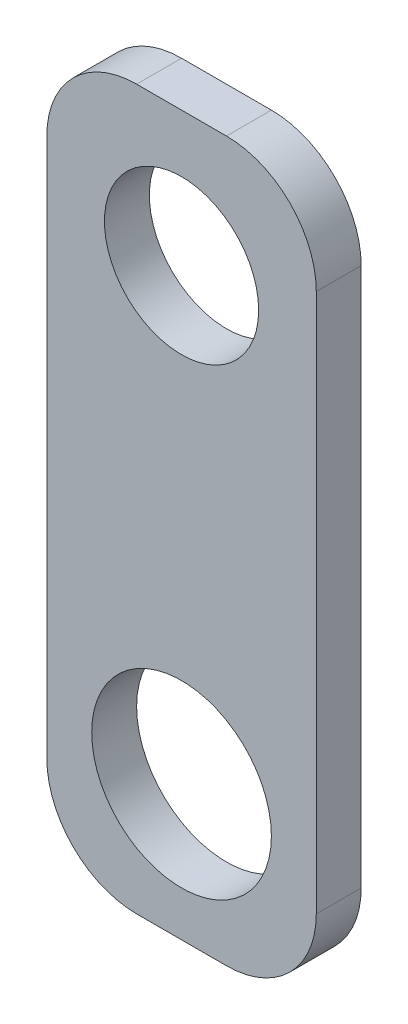
ISO-10303-21;
HEADER;
FILE_DESCRIPTION(('STEP AP214'),'2;1');
FILE_NAME('part.step','',(''),(''),'','','');
FILE_SCHEMA(('AUTOMOTIVE_DESIGN { 1 0 10303 214 1 1 1 1 }'));
ENDSEC;
DATA;
#1=APPLICATION_CONTEXT('core data for automotive mechanical design processes');
#2=APPLICATION_PROTOCOL_DEFINITION('international standard','automotive_design',2000,#1);
#3=PRODUCT_CONTEXT('',#1,'mechanical');
#4=PRODUCT('Part','Part','',(#3));
#5=PRODUCT_RELATED_PRODUCT_CATEGORY('part','',(#4));
#6=PRODUCT_DEFINITION_FORMATION('','',#4);
#7=PRODUCT_DEFINITION_CONTEXT('part definition',#1,'design');
#8=PRODUCT_DEFINITION('design','',#6,#7);
#9=PRODUCT_DEFINITION_SHAPE('','',#8);
#10=(LENGTH_UNIT() NAMED_UNIT(*) SI_UNIT(.MILLI.,.METRE.));
#11=(NAMED_UNIT(*) PLANE_ANGLE_UNIT() SI_UNIT($,.RADIAN.));
#12=(NAMED_UNIT(*) SI_UNIT($,.STERADIAN.) SOLID_ANGLE_UNIT());
#13=UNCERTAINTY_MEASURE_WITH_UNIT(LENGTH_MEASURE(1.E-05),#10,'distance_accuracy_value','');
#14=(GEOMETRIC_REPRESENTATION_CONTEXT(3) GLOBAL_UNCERTAINTY_ASSIGNED_CONTEXT((#13)) GLOBAL_UNIT_ASSIGNED_CONTEXT((#10,
#11,#12)) REPRESENTATION_CONTEXT('',''));
#15=CARTESIAN_POINT('',(0.,0.,0.));
#16=DIRECTION('',(0.,0.,1.));
#17=DIRECTION('',(1.,0.,0.));
#18=AXIS2_PLACEMENT_3D('',#15,#16,#17);
#19=CARTESIAN_POINT('',(12.7,12.7,6.35));
#20=DIRECTION('',(0.,0.,-1.));
#21=DIRECTION('',(-1.,0.,0.));
#22=AXIS2_PLACEMENT_3D('',#19,#20,#21);
#23=PLANE('',#22);
#24=CARTESIAN_POINT('',(12.7,12.7,6.35));
#25=DIRECTION('',(0.,0.,1.));
#26=DIRECTION('',(-1.,0.,0.));
#27=AXIS2_PLACEMENT_3D('',#24,#25,#26);
#28=CIRCLE('',#27,12.7);
#29=CARTESIAN_POINT('',(0.,12.7000000000001,6.35));
#30=VERTEX_POINT('',#29);
#31=CARTESIAN_POINT('',(12.7000000000001,0.,6.35));
#32=VERTEX_POINT('',#31);
#33=EDGE_CURVE('E168',#30,#32,#28,.T.);
#34=ORIENTED_EDGE('',*,*,#33,.T.);
#35=DIRECTION('',(1.,0.,0.));
#36=VECTOR('',#35,1.);
#37=CARTESIAN_POINT('',(12.7000000000001,0.,6.35));
#38=LINE('',#37,#36);
#39=CARTESIAN_POINT('',(25.3999999999999,0.,6.35));
#40=VERTEX_POINT('',#39);
#41=EDGE_CURVE('E106',#32,#40,#38,.T.);
#42=ORIENTED_EDGE('',*,*,#41,.T.);
#43=CARTESIAN_POINT('',(25.4,12.7,6.35));
#44=DIRECTION('',(0.,0.,1.));
#45=DIRECTION('',(1.,0.,0.));
#46=AXIS2_PLACEMENT_3D('',#43,#44,#45);
#47=CIRCLE('',#46,12.7);
#48=CARTESIAN_POINT('',(38.1,12.7,6.35));
#49=VERTEX_POINT('',#48);
#50=EDGE_CURVE('E191',#40,#49,#47,.T.);
#51=ORIENTED_EDGE('',*,*,#50,.T.);
#52=DIRECTION('',(0.,1.,0.));
#53=VECTOR('',#52,1.);
#54=CARTESIAN_POINT('',(38.1,12.7000000000001,6.35));
#55=LINE('',#54,#53);
#56=CARTESIAN_POINT('',(38.1,88.8999999999999,6.35));
#57=VERTEX_POINT('',#56);
#58=EDGE_CURVE('E202',#49,#57,#55,.T.);
#59=ORIENTED_EDGE('',*,*,#58,.T.);
#60=CARTESIAN_POINT('',(25.4,88.9,6.35));
#61=DIRECTION('',(0.,0.,1.));
#62=DIRECTION('',(-1.,0.,0.));
#63=AXIS2_PLACEMENT_3D('',#60,#61,#62);
#64=CIRCLE('',#63,12.7);
#65=CARTESIAN_POINT('',(25.3999999999999,101.6,6.35));
#66=VERTEX_POINT('',#65);
#67=EDGE_CURVE('E124',#57,#66,#64,.T.);
#68=ORIENTED_EDGE('',*,*,#67,.T.);
#69=DIRECTION('',(-1.,0.,0.));
#70=VECTOR('',#69,1.);
#71=CARTESIAN_POINT('',(12.7000000000001,101.6,6.35));
#72=LINE('',#71,#70);
#73=CARTESIAN_POINT('',(12.7000000000001,101.6,6.35));
#74=VERTEX_POINT('',#73);
#75=EDGE_CURVE('E116',#66,#74,#72,.T.);
#76=ORIENTED_EDGE('',*,*,#75,.T.);
#77=CARTESIAN_POINT('',(12.7,88.9,6.35));
#78=DIRECTION('',(0.,0.,1.));
#79=DIRECTION('',(-1.,0.,0.));
#80=AXIS2_PLACEMENT_3D('',#77,#78,#79);
#81=CIRCLE('',#80,12.7);
#82=CARTESIAN_POINT('',(0.,88.8999999999999,6.35));
#83=VERTEX_POINT('',#82);
#84=EDGE_CURVE('E123',#74,#83,#81,.T.);
#85=ORIENTED_EDGE('',*,*,#84,.T.);
#86=DIRECTION('',(0.,-1.,0.));
#87=VECTOR('',#86,1.);
#88=CARTESIAN_POINT('',(0.,12.7000000000001,6.35));
#89=LINE('',#88,#87);
#90=EDGE_CURVE('E64',#83,#30,#89,.T.);
#91=ORIENTED_EDGE('',*,*,#90,.T.);
#92=EDGE_LOOP('',(#34,#42,#51,#59,#68,#76,#85,#91));
#93=FACE_BOUND('',#92,.T.);
#94=CARTESIAN_POINT('',(19.05,82.55,6.35));
#95=DIRECTION('',(0.,0.,1.));
#96=DIRECTION('',(1.,0.,0.));
#97=AXIS2_PLACEMENT_3D('',#94,#95,#96);
#98=CIRCLE('',#97,10.90295);
#99=CARTESIAN_POINT('',(29.95295,82.55,6.35));
#100=VERTEX_POINT('',#99);
#101=EDGE_CURVE('E155',#100,#100,#98,.T.);
#102=ORIENTED_EDGE('',*,*,#101,.F.);
#103=EDGE_LOOP('',(#102));
#104=FACE_BOUND('',#103,.T.);
#105=CARTESIAN_POINT('',(19.05,19.05,6.35));
#106=DIRECTION('',(0.,0.,1.));
#107=DIRECTION('',(1.,0.,0.));
#108=AXIS2_PLACEMENT_3D('',#105,#106,#107);
#109=CIRCLE('',#108,12.7);
#110=CARTESIAN_POINT('',(31.75,19.05,6.35));
#111=VERTEX_POINT('',#110);
#112=EDGE_CURVE('E218',#111,#111,#109,.T.);
#113=ORIENTED_EDGE('',*,*,#112,.F.);
#114=EDGE_LOOP('',(#113));
#115=FACE_BOUND('',#114,.T.);
#116=ADVANCED_FACE('F44',(#93,#104,#115),#23,.F.);
#117=CARTESIAN_POINT('',(12.7,12.7,0.));
#118=DIRECTION('',(0.,0.,-1.));
#119=DIRECTION('',(-1.,0.,0.));
#120=AXIS2_PLACEMENT_3D('',#117,#118,#119);
#121=PLANE('',#120);
#122=CARTESIAN_POINT('',(19.05,82.55,0.));
#123=DIRECTION('',(0.,0.,1.));
#124=DIRECTION('',(1.,0.,0.));
#125=AXIS2_PLACEMENT_3D('',#122,#123,#124);
#126=CIRCLE('',#125,10.90295);
#127=CARTESIAN_POINT('',(29.95295,82.55,0.));
#128=VERTEX_POINT('',#127);
#129=EDGE_CURVE('E214',#128,#128,#126,.T.);
#130=ORIENTED_EDGE('',*,*,#129,.T.);
#131=EDGE_LOOP('',(#130));
#132=FACE_BOUND('',#131,.T.);
#133=CARTESIAN_POINT('',(12.7,12.7,0.));
#134=DIRECTION('',(0.,0.,1.));
#135=DIRECTION('',(-1.,0.,0.));
#136=AXIS2_PLACEMENT_3D('',#133,#134,#135);
#137=CIRCLE('',#136,12.7);
#138=CARTESIAN_POINT('',(0.,12.7000000000001,0.));
#139=VERTEX_POINT('',#138);
#140=CARTESIAN_POINT('',(12.7000000000001,0.,0.));
#141=VERTEX_POINT('',#140);
#142=EDGE_CURVE('E150',#139,#141,#137,.T.);
#143=ORIENTED_EDGE('',*,*,#142,.F.);
#144=DIRECTION('',(0.,-1.,0.));
#145=VECTOR('',#144,1.);
#146=CARTESIAN_POINT('',(0.,12.7000000000001,0.));
#147=LINE('',#146,#145);
#148=CARTESIAN_POINT('',(0.,88.8999999999999,0.));
#149=VERTEX_POINT('',#148);
#150=EDGE_CURVE('E98',#149,#139,#147,.T.);
#151=ORIENTED_EDGE('',*,*,#150,.F.);
#152=CARTESIAN_POINT('',(12.7,88.9,0.));
#153=DIRECTION('',(0.,0.,1.));
#154=DIRECTION('',(-1.,0.,0.));
#155=AXIS2_PLACEMENT_3D('',#152,#153,#154);
#156=CIRCLE('',#155,12.7);
#157=CARTESIAN_POINT('',(12.7000000000001,101.6,0.));
#158=VERTEX_POINT('',#157);
#159=EDGE_CURVE('E95',#158,#149,#156,.T.);
#160=ORIENTED_EDGE('',*,*,#159,.F.);
#161=DIRECTION('',(-1.,0.,0.));
#162=VECTOR('',#161,1.);
#163=CARTESIAN_POINT('',(12.7000000000001,101.6,0.));
#164=LINE('',#163,#162);
#165=CARTESIAN_POINT('',(25.3999999999999,101.6,0.));
#166=VERTEX_POINT('',#165);
#167=EDGE_CURVE('E131',#166,#158,#164,.T.);
#168=ORIENTED_EDGE('',*,*,#167,.F.);
#169=CARTESIAN_POINT('',(25.4,88.9,0.));
#170=DIRECTION('',(0.,0.,1.));
#171=DIRECTION('',(-1.,0.,0.));
#172=AXIS2_PLACEMENT_3D('',#169,#170,#171);
#173=CIRCLE('',#172,12.7);
#174=CARTESIAN_POINT('',(38.1,88.8999999999999,0.));
#175=VERTEX_POINT('',#174);
#176=EDGE_CURVE('E161',#175,#166,#173,.T.);
#177=ORIENTED_EDGE('',*,*,#176,.F.);
#178=DIRECTION('',(0.,1.,0.));
#179=VECTOR('',#178,1.);
#180=CARTESIAN_POINT('',(38.1,12.7000000000001,0.));
#181=LINE('',#180,#179);
#182=CARTESIAN_POINT('',(38.1,12.7,0.));
#183=VERTEX_POINT('',#182);
#184=EDGE_CURVE('E158',#183,#175,#181,.T.);
#185=ORIENTED_EDGE('',*,*,#184,.F.);
#186=CARTESIAN_POINT('',(25.4,12.7,0.));
#187=DIRECTION('',(0.,0.,1.));
#188=DIRECTION('',(1.,0.,0.));
#189=AXIS2_PLACEMENT_3D('',#186,#187,#188);
#190=CIRCLE('',#189,12.7);
#191=CARTESIAN_POINT('',(25.3999999999999,0.,0.));
#192=VERTEX_POINT('',#191);
#193=EDGE_CURVE('E154',#192,#183,#190,.T.);
#194=ORIENTED_EDGE('',*,*,#193,.F.);
#195=DIRECTION('',(1.,0.,0.));
#196=VECTOR('',#195,1.);
#197=CARTESIAN_POINT('',(12.7000000000001,0.,0.));
#198=LINE('',#197,#196);
#199=EDGE_CURVE('E151',#141,#192,#198,.T.);
#200=ORIENTED_EDGE('',*,*,#199,.F.);
#201=EDGE_LOOP('',(#143,#151,#160,#168,#177,#185,#194,#200));
#202=FACE_BOUND('',#201,.T.);
#203=CARTESIAN_POINT('',(19.05,19.05,0.));
#204=DIRECTION('',(0.,0.,1.));
#205=DIRECTION('',(1.,0.,0.));
#206=AXIS2_PLACEMENT_3D('',#203,#204,#205);
#207=CIRCLE('',#206,12.7);
#208=CARTESIAN_POINT('',(31.75,19.05,0.));
#209=VERTEX_POINT('',#208);
#210=EDGE_CURVE('E224',#209,#209,#207,.T.);
#211=ORIENTED_EDGE('',*,*,#210,.T.);
#212=EDGE_LOOP('',(#211));
#213=FACE_BOUND('',#212,.T.);
#214=ADVANCED_FACE('F194',(#132,#202,#213),#121,.T.);
#215=CARTESIAN_POINT('',(12.7,12.7,6.35));
#216=DIRECTION('',(0.,0.,-1.));
#217=DIRECTION('',(-1.,0.,0.));
#218=AXIS2_PLACEMENT_3D('',#215,#216,#217);
#219=CYLINDRICAL_SURFACE('',#218,12.7);
#220=ORIENTED_EDGE('',*,*,#142,.T.);
#221=DIRECTION('',(0.,0.,-1.));
#222=VECTOR('',#221,1.);
#223=CARTESIAN_POINT('',(12.7000000000001,0.,6.35));
#224=LINE('',#223,#222);
#225=EDGE_CURVE('E11',#32,#141,#224,.T.);
#226=ORIENTED_EDGE('',*,*,#225,.F.);
#227=ORIENTED_EDGE('',*,*,#33,.F.);
#228=DIRECTION('',(0.,0.,-1.));
#229=VECTOR('',#228,1.);
#230=CARTESIAN_POINT('',(0.,12.7000000000001,6.35));
#231=LINE('',#230,#229);
#232=EDGE_CURVE('E141',#30,#139,#231,.T.);
#233=ORIENTED_EDGE('',*,*,#232,.T.);
#234=EDGE_LOOP('',(#220,#226,#227,#233));
#235=FACE_BOUND('',#234,.T.);
#236=ADVANCED_FACE('F50',(#235),#219,.T.);
#237=CARTESIAN_POINT('',(12.7000000000001,0.,6.35));
#238=DIRECTION('',(0.,1.,0.));
#239=DIRECTION('',(0.,0.,1.));
#240=AXIS2_PLACEMENT_3D('',#237,#238,#239);
#241=PLANE('',#240);
#242=ORIENTED_EDGE('',*,*,#199,.T.);
#243=DIRECTION('',(0.,0.,-1.));
#244=VECTOR('',#243,1.);
#245=CARTESIAN_POINT('',(25.3999999999999,0.,6.35));
#246=LINE('',#245,#244);
#247=EDGE_CURVE('E54',#40,#192,#246,.T.);
#248=ORIENTED_EDGE('',*,*,#247,.F.);
#249=ORIENTED_EDGE('',*,*,#41,.F.);
#250=ORIENTED_EDGE('',*,*,#225,.T.);
#251=EDGE_LOOP('',(#242,#248,#249,#250));
#252=FACE_BOUND('',#251,.T.);
#253=ADVANCED_FACE('F260',(#252),#241,.F.);
#254=CARTESIAN_POINT('',(25.4,12.7,6.35));
#255=DIRECTION('',(0.,0.,-1.));
#256=DIRECTION('',(-1.,0.,0.));
#257=AXIS2_PLACEMENT_3D('',#254,#255,#256);
#258=CYLINDRICAL_SURFACE('',#257,12.7);
#259=ORIENTED_EDGE('',*,*,#193,.T.);
#260=DIRECTION('',(0.,0.,-1.));
#261=VECTOR('',#260,1.);
#262=CARTESIAN_POINT('',(38.1,12.7,6.35));
#263=LINE('',#262,#261);
#264=EDGE_CURVE('E182',#49,#183,#263,.T.);
#265=ORIENTED_EDGE('',*,*,#264,.F.);
#266=ORIENTED_EDGE('',*,*,#50,.F.);
#267=ORIENTED_EDGE('',*,*,#247,.T.);
#268=EDGE_LOOP('',(#259,#265,#266,#267));
#269=FACE_BOUND('',#268,.T.);
#270=ADVANCED_FACE('F186',(#269),#258,.T.);
#271=CARTESIAN_POINT('',(38.1,12.7000000000001,6.35));
#272=DIRECTION('',(-1.,0.,0.));
#273=DIRECTION('',(0.,-1.,0.));
#274=AXIS2_PLACEMENT_3D('',#271,#272,#273);
#275=PLANE('',#274);
#276=ORIENTED_EDGE('',*,*,#184,.T.);
#277=DIRECTION('',(0.,0.,-1.));
#278=VECTOR('',#277,1.);
#279=CARTESIAN_POINT('',(38.1,88.8999999999999,6.35));
#280=LINE('',#279,#278);
#281=EDGE_CURVE('E180',#57,#175,#280,.T.);
#282=ORIENTED_EDGE('',*,*,#281,.F.);
#283=ORIENTED_EDGE('',*,*,#58,.F.);
#284=ORIENTED_EDGE('',*,*,#264,.T.);
#285=EDGE_LOOP('',(#276,#282,#283,#284));
#286=FACE_BOUND('',#285,.T.);
#287=ADVANCED_FACE('F199',(#286),#275,.F.);
#288=CARTESIAN_POINT('',(25.4,88.9,6.35));
#289=DIRECTION('',(0.,0.,-1.));
#290=DIRECTION('',(-1.,0.,0.));
#291=AXIS2_PLACEMENT_3D('',#288,#289,#290);
#292=CYLINDRICAL_SURFACE('',#291,12.7);
#293=ORIENTED_EDGE('',*,*,#176,.T.);
#294=DIRECTION('',(0.,0.,-1.));
#295=VECTOR('',#294,1.);
#296=CARTESIAN_POINT('',(25.3999999999999,101.6,6.35));
#297=LINE('',#296,#295);
#298=EDGE_CURVE('E136',#66,#166,#297,.T.);
#299=ORIENTED_EDGE('',*,*,#298,.F.);
#300=ORIENTED_EDGE('',*,*,#67,.F.);
#301=ORIENTED_EDGE('',*,*,#281,.T.);
#302=EDGE_LOOP('',(#293,#299,#300,#301));
#303=FACE_BOUND('',#302,.T.);
#304=ADVANCED_FACE('F201',(#303),#292,.T.);
#305=CARTESIAN_POINT('',(12.7000000000001,101.6,6.35));
#306=DIRECTION('',(0.,-1.,0.));
#307=DIRECTION('',(0.,0.,-1.));
#308=AXIS2_PLACEMENT_3D('',#305,#306,#307);
#309=PLANE('',#308);
#310=ORIENTED_EDGE('',*,*,#167,.T.);
#311=DIRECTION('',(0.,0.,-1.));
#312=VECTOR('',#311,1.);
#313=CARTESIAN_POINT('',(12.7000000000001,101.6,6.35));
#314=LINE('',#313,#312);
#315=EDGE_CURVE('E132',#74,#158,#314,.T.);
#316=ORIENTED_EDGE('',*,*,#315,.F.);
#317=ORIENTED_EDGE('',*,*,#75,.F.);
#318=ORIENTED_EDGE('',*,*,#298,.T.);
#319=EDGE_LOOP('',(#310,#316,#317,#318));
#320=FACE_BOUND('',#319,.T.);
#321=ADVANCED_FACE('F135',(#320),#309,.F.);
#322=CARTESIAN_POINT('',(12.7,88.9,6.35));
#323=DIRECTION('',(0.,0.,-1.));
#324=DIRECTION('',(-1.,0.,0.));
#325=AXIS2_PLACEMENT_3D('',#322,#323,#324);
#326=CYLINDRICAL_SURFACE('',#325,12.7);
#327=ORIENTED_EDGE('',*,*,#159,.T.);
#328=DIRECTION('',(0.,0.,-1.));
#329=VECTOR('',#328,1.);
#330=CARTESIAN_POINT('',(0.,88.8999999999999,6.35));
#331=LINE('',#330,#329);
#332=EDGE_CURVE('E140',#83,#149,#331,.T.);
#333=ORIENTED_EDGE('',*,*,#332,.F.);
#334=ORIENTED_EDGE('',*,*,#84,.F.);
#335=ORIENTED_EDGE('',*,*,#315,.T.);
#336=EDGE_LOOP('',(#327,#333,#334,#335));
#337=FACE_BOUND('',#336,.T.);
#338=ADVANCED_FACE('F137',(#337),#326,.T.);
#339=CARTESIAN_POINT('',(0.,12.7000000000001,6.35));
#340=DIRECTION('',(1.,0.,0.));
#341=DIRECTION('',(0.,0.,-1.));
#342=AXIS2_PLACEMENT_3D('',#339,#340,#341);
#343=PLANE('',#342);
#344=ORIENTED_EDGE('',*,*,#150,.T.);
#345=ORIENTED_EDGE('',*,*,#232,.F.);
#346=ORIENTED_EDGE('',*,*,#90,.F.);
#347=ORIENTED_EDGE('',*,*,#332,.T.);
#348=EDGE_LOOP('',(#344,#345,#346,#347));
#349=FACE_BOUND('',#348,.T.);
#350=ADVANCED_FACE('F243',(#349),#343,.F.);
#351=CARTESIAN_POINT('',(19.05,82.55,6.35));
#352=DIRECTION('',(0.,0.,-1.));
#353=DIRECTION('',(-1.,0.,0.));
#354=AXIS2_PLACEMENT_3D('',#351,#352,#353);
#355=CYLINDRICAL_SURFACE('',#354,10.90295);
#356=ORIENTED_EDGE('',*,*,#101,.T.);
#357=EDGE_LOOP('',(#356));
#358=FACE_BOUND('',#357,.T.);
#359=ORIENTED_EDGE('',*,*,#129,.F.);
#360=EDGE_LOOP('',(#359));
#361=FACE_BOUND('',#360,.T.);
#362=ADVANCED_FACE('F245',(#358,#361),#355,.F.);
#363=CARTESIAN_POINT('',(19.05,19.05,6.35));
#364=DIRECTION('',(0.,0.,-1.));
#365=DIRECTION('',(-1.,0.,0.));
#366=AXIS2_PLACEMENT_3D('',#363,#364,#365);
#367=CYLINDRICAL_SURFACE('',#366,12.7);
#368=ORIENTED_EDGE('',*,*,#112,.T.);
#369=EDGE_LOOP('',(#368));
#370=FACE_BOUND('',#369,.T.);
#371=ORIENTED_EDGE('',*,*,#210,.F.);
#372=EDGE_LOOP('',(#371));
#373=FACE_BOUND('',#372,.T.);
#374=ADVANCED_FACE('F231',(#370,#373),#367,.F.);
#375=CLOSED_SHELL('',(#116,#214,#236,#253,#270,#287,#304,#321,#338,#350,#362,#374));
#376=MANIFOLD_SOLID_BREP('B2',#375);
#377=ADVANCED_BREP_SHAPE_REPRESENTATION('',(#18,#376),#14);
#378=SHAPE_DEFINITION_REPRESENTATION(#9,#377);
ENDSEC;
END-ISO-10303-21;
